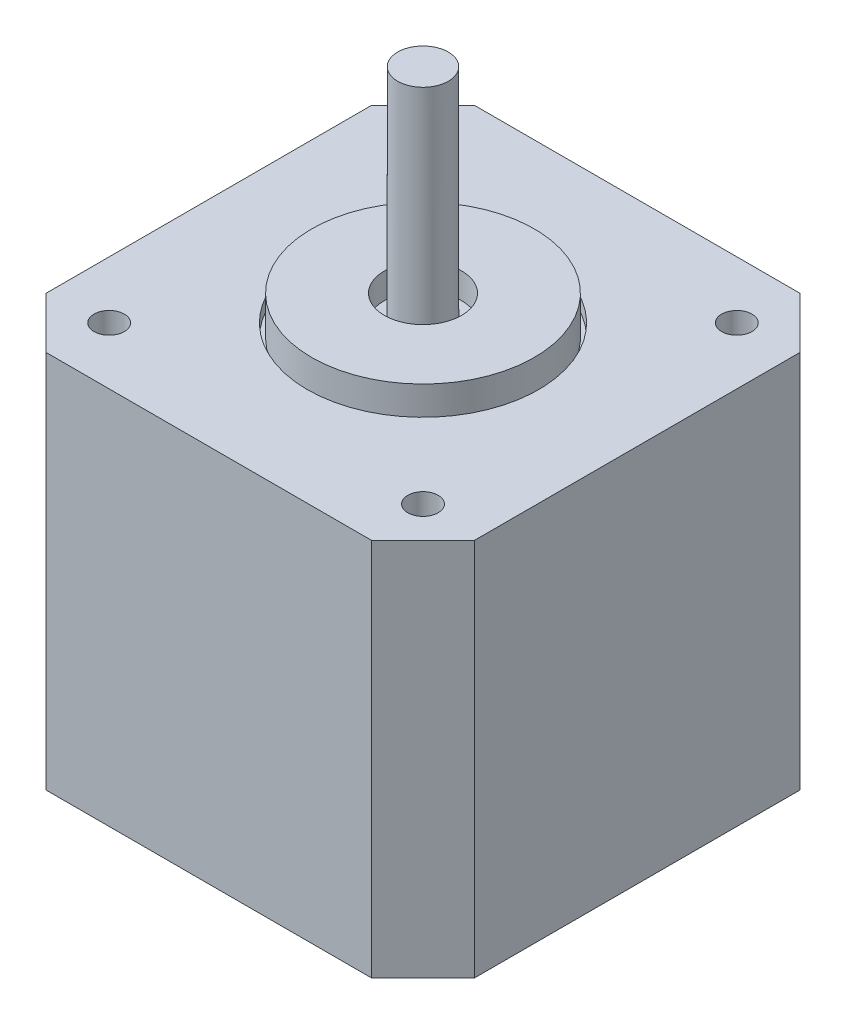
ISO-10303-21;
HEADER;
FILE_DESCRIPTION(('STEP AP214'),'2;1');
FILE_NAME('part.step','',(''),(''),'','','');
FILE_SCHEMA(('AUTOMOTIVE_DESIGN { 1 0 10303 214 1 1 1 1 }'));
ENDSEC;
DATA;
#1=APPLICATION_CONTEXT('core data for automotive mechanical design processes');
#2=APPLICATION_PROTOCOL_DEFINITION('international standard','automotive_design',2000,#1);
#3=PRODUCT_CONTEXT('',#1,'mechanical');
#4=PRODUCT('Part','Part','',(#3));
#5=PRODUCT_RELATED_PRODUCT_CATEGORY('part','',(#4));
#6=PRODUCT_DEFINITION_FORMATION('','',#4);
#7=PRODUCT_DEFINITION_CONTEXT('part definition',#1,'design');
#8=PRODUCT_DEFINITION('design','',#6,#7);
#9=PRODUCT_DEFINITION_SHAPE('','',#8);
#10=(LENGTH_UNIT() NAMED_UNIT(*) SI_UNIT(.MILLI.,.METRE.));
#11=(NAMED_UNIT(*) PLANE_ANGLE_UNIT() SI_UNIT($,.RADIAN.));
#12=(NAMED_UNIT(*) SI_UNIT($,.STERADIAN.) SOLID_ANGLE_UNIT());
#13=UNCERTAINTY_MEASURE_WITH_UNIT(LENGTH_MEASURE(1.E-05),#10,'distance_accuracy_value','');
#14=(GEOMETRIC_REPRESENTATION_CONTEXT(3) GLOBAL_UNCERTAINTY_ASSIGNED_CONTEXT((#13)) GLOBAL_UNIT_ASSIGNED_CONTEXT((#10,
#11,#12)) REPRESENTATION_CONTEXT('',''));
#15=CARTESIAN_POINT('',(0.,0.,0.));
#16=DIRECTION('',(0.,0.,1.));
#17=DIRECTION('',(1.,0.,0.));
#18=AXIS2_PLACEMENT_3D('',#15,#16,#17);
#19=CARTESIAN_POINT('',(0.,37.4396,0.));
#20=DIRECTION('',(0.,-1.,0.));
#21=DIRECTION('',(0.,0.,-1.));
#22=AXIS2_PLACEMENT_3D('',#19,#20,#21);
#23=PLANE('',#22);
#24=CARTESIAN_POINT('',(0.,37.4396,0.));
#25=DIRECTION('',(0.,1.,0.));
#26=DIRECTION('',(0.,0.,1.));
#27=AXIS2_PLACEMENT_3D('',#24,#25,#26);
#28=CIRCLE('',#27,3.81);
#29=CARTESIAN_POINT('',(0.,37.4396,3.81));
#30=VERTEX_POINT('',#29);
#31=EDGE_CURVE('E191',#30,#30,#28,.T.);
#32=ORIENTED_EDGE('',*,*,#31,.T.);
#33=EDGE_LOOP('',(#32));
#34=FACE_BOUND('',#33,.T.);
#35=CARTESIAN_POINT('',(0.,37.4396,0.));
#36=DIRECTION('',(0.,-1.,0.));
#37=DIRECTION('',(0.,0.,-1.));
#38=AXIS2_PLACEMENT_3D('',#35,#36,#37);
#39=CIRCLE('',#38,2.5);
#40=CARTESIAN_POINT('',(0.,37.4396,-2.5));
#41=VERTEX_POINT('',#40);
#42=EDGE_CURVE('E11',#41,#41,#39,.F.);
#43=ORIENTED_EDGE('',*,*,#42,.F.);
#44=EDGE_LOOP('',(#43));
#45=FACE_BOUND('',#44,.T.);
#46=ADVANCED_FACE('F34',(#34,#45),#23,.F.);
#47=CARTESIAN_POINT('',(21.15,37.4396,21.15));
#48=DIRECTION('',(-1.,0.,0.));
#49=DIRECTION('',(0.,0.,1.));
#50=AXIS2_PLACEMENT_3D('',#47,#48,#49);
#51=PLANE('',#50);
#52=DIRECTION('',(0.,0.,-1.));
#53=VECTOR('',#52,1.);
#54=CARTESIAN_POINT('',(21.15,0.,21.15));
#55=LINE('',#54,#53);
#56=CARTESIAN_POINT('',(21.15,0.,16.07));
#57=VERTEX_POINT('',#56);
#58=CARTESIAN_POINT('',(21.15,0.,-16.07));
#59=VERTEX_POINT('',#58);
#60=EDGE_CURVE('E163',#57,#59,#55,.T.);
#61=ORIENTED_EDGE('',*,*,#60,.T.);
#62=DIRECTION('',(0.,1.,0.));
#63=VECTOR('',#62,1.);
#64=CARTESIAN_POINT('',(21.15,37.4396,-16.07));
#65=LINE('',#64,#63);
#66=CARTESIAN_POINT('',(21.15,37.4396,-16.07));
#67=VERTEX_POINT('',#66);
#68=EDGE_CURVE('E42',#59,#67,#65,.T.);
#69=ORIENTED_EDGE('',*,*,#68,.T.);
#70=DIRECTION('',(0.,0.,-1.));
#71=VECTOR('',#70,1.);
#72=CARTESIAN_POINT('',(21.15,37.4396,21.15));
#73=LINE('',#72,#71);
#74=CARTESIAN_POINT('',(21.15,37.4396,16.07));
#75=VERTEX_POINT('',#74);
#76=EDGE_CURVE('E127',#75,#67,#73,.T.);
#77=ORIENTED_EDGE('',*,*,#76,.F.);
#78=DIRECTION('',(0.,-1.,0.));
#79=VECTOR('',#78,1.);
#80=CARTESIAN_POINT('',(21.15,37.4396,16.07));
#81=LINE('',#80,#79);
#82=EDGE_CURVE('E155',#75,#57,#81,.T.);
#83=ORIENTED_EDGE('',*,*,#82,.T.);
#84=EDGE_LOOP('',(#61,#69,#77,#83));
#85=FACE_BOUND('',#84,.T.);
#86=ADVANCED_FACE('F161',(#85),#51,.F.);
#87=CARTESIAN_POINT('',(-21.15,37.4396,-21.15));
#88=DIRECTION('',(0.,0.,1.));
#89=DIRECTION('',(1.,0.,0.));
#90=AXIS2_PLACEMENT_3D('',#87,#88,#89);
#91=PLANE('',#90);
#92=DIRECTION('',(-1.,0.,0.));
#93=VECTOR('',#92,1.);
#94=CARTESIAN_POINT('',(-21.15,0.,-21.15));
#95=LINE('',#94,#93);
#96=CARTESIAN_POINT('',(16.07,0.,-21.15));
#97=VERTEX_POINT('',#96);
#98=CARTESIAN_POINT('',(-16.07,0.,-21.15));
#99=VERTEX_POINT('',#98);
#100=EDGE_CURVE('E132',#97,#99,#95,.T.);
#101=ORIENTED_EDGE('',*,*,#100,.T.);
#102=DIRECTION('',(0.,1.,0.));
#103=VECTOR('',#102,1.);
#104=CARTESIAN_POINT('',(-16.07,37.4396,-21.15));
#105=LINE('',#104,#103);
#106=CARTESIAN_POINT('',(-16.07,37.4396,-21.15));
#107=VERTEX_POINT('',#106);
#108=EDGE_CURVE('E49',#99,#107,#105,.T.);
#109=ORIENTED_EDGE('',*,*,#108,.T.);
#110=DIRECTION('',(-1.,0.,0.));
#111=VECTOR('',#110,1.);
#112=CARTESIAN_POINT('',(-21.15,37.4396,-21.15));
#113=LINE('',#112,#111);
#114=CARTESIAN_POINT('',(16.07,37.4396,-21.15));
#115=VERTEX_POINT('',#114);
#116=EDGE_CURVE('E130',#115,#107,#113,.T.);
#117=ORIENTED_EDGE('',*,*,#116,.F.);
#118=DIRECTION('',(0.,-1.,0.));
#119=VECTOR('',#118,1.);
#120=CARTESIAN_POINT('',(16.07,37.4396,-21.15));
#121=LINE('',#120,#119);
#122=EDGE_CURVE('E151',#115,#97,#121,.T.);
#123=ORIENTED_EDGE('',*,*,#122,.T.);
#124=EDGE_LOOP('',(#101,#109,#117,#123));
#125=FACE_BOUND('',#124,.T.);
#126=ADVANCED_FACE('F171',(#125),#91,.F.);
#127=CARTESIAN_POINT('',(-21.15,37.4396,21.15));
#128=DIRECTION('',(1.,0.,0.));
#129=DIRECTION('',(0.,0.,-1.));
#130=AXIS2_PLACEMENT_3D('',#127,#128,#129);
#131=PLANE('',#130);
#132=DIRECTION('',(0.,0.,1.));
#133=VECTOR('',#132,1.);
#134=CARTESIAN_POINT('',(-21.15,0.,21.15));
#135=LINE('',#134,#133);
#136=CARTESIAN_POINT('',(-21.15,0.,-16.07));
#137=VERTEX_POINT('',#136);
#138=CARTESIAN_POINT('',(-21.15,0.,16.07));
#139=VERTEX_POINT('',#138);
#140=EDGE_CURVE('E128',#137,#139,#135,.T.);
#141=ORIENTED_EDGE('',*,*,#140,.T.);
#142=DIRECTION('',(0.,1.,0.));
#143=VECTOR('',#142,1.);
#144=CARTESIAN_POINT('',(-21.15,37.4396,16.07));
#145=LINE('',#144,#143);
#146=CARTESIAN_POINT('',(-21.15,37.4396,16.07));
#147=VERTEX_POINT('',#146);
#148=EDGE_CURVE('E106',#139,#147,#145,.T.);
#149=ORIENTED_EDGE('',*,*,#148,.T.);
#150=DIRECTION('',(0.,0.,1.));
#151=VECTOR('',#150,1.);
#152=CARTESIAN_POINT('',(-21.15,37.4396,21.15));
#153=LINE('',#152,#151);
#154=CARTESIAN_POINT('',(-21.15,37.4396,-16.07));
#155=VERTEX_POINT('',#154);
#156=EDGE_CURVE('E176',#155,#147,#153,.T.);
#157=ORIENTED_EDGE('',*,*,#156,.F.);
#158=DIRECTION('',(0.,-1.,0.));
#159=VECTOR('',#158,1.);
#160=CARTESIAN_POINT('',(-21.15,37.4396,-16.07));
#161=LINE('',#160,#159);
#162=EDGE_CURVE('E111',#155,#137,#161,.T.);
#163=ORIENTED_EDGE('',*,*,#162,.T.);
#164=EDGE_LOOP('',(#141,#149,#157,#163));
#165=FACE_BOUND('',#164,.T.);
#166=ADVANCED_FACE('F264',(#165),#131,.F.);
#167=CARTESIAN_POINT('',(-21.15,37.4396,21.15));
#168=DIRECTION('',(0.,0.,-1.));
#169=DIRECTION('',(-1.,0.,0.));
#170=AXIS2_PLACEMENT_3D('',#167,#168,#169);
#171=PLANE('',#170);
#172=DIRECTION('',(1.,0.,0.));
#173=VECTOR('',#172,1.);
#174=CARTESIAN_POINT('',(-21.15,37.4396,21.15));
#175=LINE('',#174,#173);
#176=CARTESIAN_POINT('',(-16.07,37.4396,21.15));
#177=VERTEX_POINT('',#176);
#178=CARTESIAN_POINT('',(16.07,37.4396,21.15));
#179=VERTEX_POINT('',#178);
#180=EDGE_CURVE('E121',#177,#179,#175,.T.);
#181=ORIENTED_EDGE('',*,*,#180,.F.);
#182=DIRECTION('',(0.,-1.,0.));
#183=VECTOR('',#182,1.);
#184=CARTESIAN_POINT('',(-16.07,37.4396,21.15));
#185=LINE('',#184,#183);
#186=CARTESIAN_POINT('',(-16.07,0.,21.15));
#187=VERTEX_POINT('',#186);
#188=EDGE_CURVE('E105',#177,#187,#185,.T.);
#189=ORIENTED_EDGE('',*,*,#188,.T.);
#190=DIRECTION('',(1.,0.,0.));
#191=VECTOR('',#190,1.);
#192=CARTESIAN_POINT('',(-21.15,0.,21.15));
#193=LINE('',#192,#191);
#194=CARTESIAN_POINT('',(16.07,0.,21.15));
#195=VERTEX_POINT('',#194);
#196=EDGE_CURVE('E118',#187,#195,#193,.T.);
#197=ORIENTED_EDGE('',*,*,#196,.T.);
#198=DIRECTION('',(0.,1.,0.));
#199=VECTOR('',#198,1.);
#200=CARTESIAN_POINT('',(16.07,37.4396,21.15));
#201=LINE('',#200,#199);
#202=EDGE_CURVE('E123',#195,#179,#201,.T.);
#203=ORIENTED_EDGE('',*,*,#202,.T.);
#204=EDGE_LOOP('',(#181,#189,#197,#203));
#205=FACE_BOUND('',#204,.T.);
#206=ADVANCED_FACE('F117',(#205),#171,.F.);
#207=CARTESIAN_POINT('',(-15.5,37.4396,-15.5));
#208=DIRECTION('',(0.,1.,0.));
#209=DIRECTION('',(0.,0.,1.));
#210=AXIS2_PLACEMENT_3D('',#207,#208,#209);
#211=CIRCLE('',#210,1.5);
#212=CARTESIAN_POINT('',(-15.5,37.4396,-14.));
#213=VERTEX_POINT('',#212);
#214=EDGE_CURVE('E215',#213,#213,#211,.T.);
#215=ORIENTED_EDGE('',*,*,#214,.F.);
#216=EDGE_LOOP('',(#215));
#217=FACE_BOUND('',#216,.T.);
#218=CARTESIAN_POINT('',(-15.5,37.4396,15.5));
#219=DIRECTION('',(0.,1.,0.));
#220=DIRECTION('',(0.,0.,1.));
#221=AXIS2_PLACEMENT_3D('',#218,#219,#220);
#222=CIRCLE('',#221,1.5);
#223=CARTESIAN_POINT('',(-15.5,37.4396,17.));
#224=VERTEX_POINT('',#223);
#225=EDGE_CURVE('E209',#224,#224,#222,.T.);
#226=ORIENTED_EDGE('',*,*,#225,.F.);
#227=EDGE_LOOP('',(#226));
#228=FACE_BOUND('',#227,.T.);
#229=CARTESIAN_POINT('',(15.5,37.4396,15.5));
#230=DIRECTION('',(0.,1.,0.));
#231=DIRECTION('',(0.,0.,1.));
#232=AXIS2_PLACEMENT_3D('',#229,#230,#231);
#233=CIRCLE('',#232,1.5);
#234=CARTESIAN_POINT('',(15.5,37.4396,17.));
#235=VERTEX_POINT('',#234);
#236=EDGE_CURVE('E203',#235,#235,#233,.T.);
#237=ORIENTED_EDGE('',*,*,#236,.F.);
#238=EDGE_LOOP('',(#237));
#239=FACE_BOUND('',#238,.T.);
#240=CARTESIAN_POINT('',(15.5,37.4396,-15.5));
#241=DIRECTION('',(0.,1.,0.));
#242=DIRECTION('',(0.,0.,1.));
#243=AXIS2_PLACEMENT_3D('',#240,#241,#242);
#244=CIRCLE('',#243,1.5);
#245=CARTESIAN_POINT('',(15.5,37.4396,-14.));
#246=VERTEX_POINT('',#245);
#247=EDGE_CURVE('E199',#246,#246,#244,.T.);
#248=ORIENTED_EDGE('',*,*,#247,.F.);
#249=EDGE_LOOP('',(#248));
#250=FACE_BOUND('',#249,.T.);
#251=CARTESIAN_POINT('',(0.,37.4396,0.));
#252=DIRECTION('',(0.,1.,0.));
#253=DIRECTION('',(0.,0.,1.));
#254=AXIS2_PLACEMENT_3D('',#251,#252,#253);
#255=CIRCLE('',#254,11.43);
#256=CARTESIAN_POINT('',(0.,37.4396,11.43));
#257=VERTEX_POINT('',#256);
#258=EDGE_CURVE('E179',#257,#257,#255,.T.);
#259=ORIENTED_EDGE('',*,*,#258,.F.);
#260=EDGE_LOOP('',(#259));
#261=FACE_BOUND('',#260,.T.);
#262=ORIENTED_EDGE('',*,*,#156,.T.);
#263=DIRECTION('',(-0.707106781186546,0.,-0.707106781186549));
#264=VECTOR('',#263,1.);
#265=CARTESIAN_POINT('',(-16.07,37.4396,21.15));
#266=LINE('',#265,#264);
#267=EDGE_CURVE('E149',#147,#177,#266,.F.);
#268=ORIENTED_EDGE('',*,*,#267,.T.);
#269=ORIENTED_EDGE('',*,*,#180,.T.);
#270=DIRECTION('',(-0.707106781186548,0.,0.707106781186547));
#271=VECTOR('',#270,1.);
#272=CARTESIAN_POINT('',(21.15,37.4396,16.07));
#273=LINE('',#272,#271);
#274=EDGE_CURVE('E144',#179,#75,#273,.F.);
#275=ORIENTED_EDGE('',*,*,#274,.T.);
#276=ORIENTED_EDGE('',*,*,#76,.T.);
#277=DIRECTION('',(0.707106781186546,0.,0.707106781186549));
#278=VECTOR('',#277,1.);
#279=CARTESIAN_POINT('',(16.07,37.4396,-21.15));
#280=LINE('',#279,#278);
#281=EDGE_CURVE('E56',#67,#115,#280,.F.);
#282=ORIENTED_EDGE('',*,*,#281,.T.);
#283=ORIENTED_EDGE('',*,*,#116,.T.);
#284=DIRECTION('',(0.707106781186549,0.,-0.707106781186547));
#285=VECTOR('',#284,1.);
#286=CARTESIAN_POINT('',(-21.15,37.4396,-16.07));
#287=LINE('',#286,#285);
#288=EDGE_CURVE('E147',#107,#155,#287,.F.);
#289=ORIENTED_EDGE('',*,*,#288,.T.);
#290=EDGE_LOOP('',(#262,#268,#269,#275,#276,#282,#283,#289));
#291=FACE_BOUND('',#290,.T.);
#292=ADVANCED_FACE('F166',(#217,#228,#239,#250,#261,#291),#23,.F.);
#293=CARTESIAN_POINT('',(0.,0.,0.));
#294=DIRECTION('',(0.,-1.,0.));
#295=DIRECTION('',(0.,0.,-1.));
#296=AXIS2_PLACEMENT_3D('',#293,#294,#295);
#297=PLANE('',#296);
#298=CARTESIAN_POINT('',(-15.5,0.,-15.5));
#299=DIRECTION('',(0.,-1.,0.));
#300=DIRECTION('',(0.,0.,-1.));
#301=AXIS2_PLACEMENT_3D('',#298,#299,#300);
#302=CIRCLE('',#301,1.5);
#303=CARTESIAN_POINT('',(-15.5,0.,-17.));
#304=VERTEX_POINT('',#303);
#305=EDGE_CURVE('E218',#304,#304,#302,.F.);
#306=ORIENTED_EDGE('',*,*,#305,.T.);
#307=EDGE_LOOP('',(#306));
#308=FACE_BOUND('',#307,.T.);
#309=CARTESIAN_POINT('',(-15.5,0.,15.5));
#310=DIRECTION('',(0.,-1.,0.));
#311=DIRECTION('',(0.,0.,-1.));
#312=AXIS2_PLACEMENT_3D('',#309,#310,#311);
#313=CIRCLE('',#312,1.5);
#314=CARTESIAN_POINT('',(-15.5,0.,14.));
#315=VERTEX_POINT('',#314);
#316=EDGE_CURVE('E212',#315,#315,#313,.F.);
#317=ORIENTED_EDGE('',*,*,#316,.T.);
#318=EDGE_LOOP('',(#317));
#319=FACE_BOUND('',#318,.T.);
#320=CARTESIAN_POINT('',(15.5,0.,15.5));
#321=DIRECTION('',(0.,-1.,0.));
#322=DIRECTION('',(0.,0.,-1.));
#323=AXIS2_PLACEMENT_3D('',#320,#321,#322);
#324=CIRCLE('',#323,1.5);
#325=CARTESIAN_POINT('',(15.5,0.,14.));
#326=VERTEX_POINT('',#325);
#327=EDGE_CURVE('E206',#326,#326,#324,.F.);
#328=ORIENTED_EDGE('',*,*,#327,.T.);
#329=EDGE_LOOP('',(#328));
#330=FACE_BOUND('',#329,.T.);
#331=CARTESIAN_POINT('',(15.5,0.,-15.5));
#332=DIRECTION('',(0.,-1.,0.));
#333=DIRECTION('',(0.,0.,-1.));
#334=AXIS2_PLACEMENT_3D('',#331,#332,#333);
#335=CIRCLE('',#334,1.5);
#336=CARTESIAN_POINT('',(15.5,0.,-17.));
#337=VERTEX_POINT('',#336);
#338=EDGE_CURVE('E200',#337,#337,#335,.F.);
#339=ORIENTED_EDGE('',*,*,#338,.T.);
#340=EDGE_LOOP('',(#339));
#341=FACE_BOUND('',#340,.T.);
#342=ORIENTED_EDGE('',*,*,#196,.F.);
#343=DIRECTION('',(0.707106781186546,0.,0.707106781186549));
#344=VECTOR('',#343,1.);
#345=CARTESIAN_POINT('',(-18.61,0.,18.61));
#346=LINE('',#345,#344);
#347=EDGE_CURVE('E101',#187,#139,#346,.F.);
#348=ORIENTED_EDGE('',*,*,#347,.T.);
#349=ORIENTED_EDGE('',*,*,#140,.F.);
#350=DIRECTION('',(-0.707106781186549,0.,0.707106781186547));
#351=VECTOR('',#350,1.);
#352=CARTESIAN_POINT('',(-18.61,0.,-18.61));
#353=LINE('',#352,#351);
#354=EDGE_CURVE('E112',#137,#99,#353,.F.);
#355=ORIENTED_EDGE('',*,*,#354,.T.);
#356=ORIENTED_EDGE('',*,*,#100,.F.);
#357=DIRECTION('',(-0.707106781186546,0.,-0.707106781186549));
#358=VECTOR('',#357,1.);
#359=CARTESIAN_POINT('',(18.61,0.,-18.61));
#360=LINE('',#359,#358);
#361=EDGE_CURVE('E138',#97,#59,#360,.F.);
#362=ORIENTED_EDGE('',*,*,#361,.T.);
#363=ORIENTED_EDGE('',*,*,#60,.F.);
#364=DIRECTION('',(0.707106781186548,0.,-0.707106781186547));
#365=VECTOR('',#364,1.);
#366=CARTESIAN_POINT('',(18.61,0.,18.61));
#367=LINE('',#366,#365);
#368=EDGE_CURVE('E122',#57,#195,#367,.F.);
#369=ORIENTED_EDGE('',*,*,#368,.T.);
#370=EDGE_LOOP('',(#342,#348,#349,#355,#356,#362,#363,#369));
#371=FACE_BOUND('',#370,.T.);
#372=ADVANCED_FACE('F125',(#308,#319,#330,#341,#371),#297,.T.);
#373=CARTESIAN_POINT('',(-16.07,37.4396,21.15));
#374=DIRECTION('',(0.707106781186549,0.,-0.707106781186546));
#375=DIRECTION('',(0.,-1.,0.));
#376=AXIS2_PLACEMENT_3D('',#373,#374,#375);
#377=PLANE('',#376);
#378=ORIENTED_EDGE('',*,*,#267,.F.);
#379=ORIENTED_EDGE('',*,*,#148,.F.);
#380=ORIENTED_EDGE('',*,*,#347,.F.);
#381=ORIENTED_EDGE('',*,*,#188,.F.);
#382=EDGE_LOOP('',(#378,#379,#380,#381));
#383=FACE_BOUND('',#382,.T.);
#384=ADVANCED_FACE('F104',(#383),#377,.F.);
#385=CARTESIAN_POINT('',(-21.15,37.4396,-16.07));
#386=DIRECTION('',(0.707106781186546,0.,0.707106781186548));
#387=DIRECTION('',(0.,-1.,0.));
#388=AXIS2_PLACEMENT_3D('',#385,#386,#387);
#389=PLANE('',#388);
#390=ORIENTED_EDGE('',*,*,#288,.F.);
#391=ORIENTED_EDGE('',*,*,#108,.F.);
#392=ORIENTED_EDGE('',*,*,#354,.F.);
#393=ORIENTED_EDGE('',*,*,#162,.F.);
#394=EDGE_LOOP('',(#390,#391,#392,#393));
#395=FACE_BOUND('',#394,.T.);
#396=ADVANCED_FACE('F272',(#395),#389,.F.);
#397=CARTESIAN_POINT('',(16.07,37.4396,-21.15));
#398=DIRECTION('',(-0.707106781186549,0.,0.707106781186546));
#399=DIRECTION('',(0.,-1.,0.));
#400=AXIS2_PLACEMENT_3D('',#397,#398,#399);
#401=PLANE('',#400);
#402=ORIENTED_EDGE('',*,*,#281,.F.);
#403=ORIENTED_EDGE('',*,*,#68,.F.);
#404=ORIENTED_EDGE('',*,*,#361,.F.);
#405=ORIENTED_EDGE('',*,*,#122,.F.);
#406=EDGE_LOOP('',(#402,#403,#404,#405));
#407=FACE_BOUND('',#406,.T.);
#408=ADVANCED_FACE('F169',(#407),#401,.F.);
#409=CARTESIAN_POINT('',(21.15,37.4396,16.07));
#410=DIRECTION('',(-0.707106781186547,0.,-0.707106781186548));
#411=DIRECTION('',(0.,-1.,0.));
#412=AXIS2_PLACEMENT_3D('',#409,#410,#411);
#413=PLANE('',#412);
#414=ORIENTED_EDGE('',*,*,#274,.F.);
#415=ORIENTED_EDGE('',*,*,#202,.F.);
#416=ORIENTED_EDGE('',*,*,#368,.F.);
#417=ORIENTED_EDGE('',*,*,#82,.F.);
#418=EDGE_LOOP('',(#414,#415,#416,#417));
#419=FACE_BOUND('',#418,.T.);
#420=ADVANCED_FACE('F36',(#419),#413,.F.);
#421=CARTESIAN_POINT('',(0.,36.1696,0.));
#422=DIRECTION('',(0.,1.,0.));
#423=DIRECTION('',(0.,0.,1.));
#424=AXIS2_PLACEMENT_3D('',#421,#422,#423);
#425=CYLINDRICAL_SURFACE('',#424,11.43);
#426=CARTESIAN_POINT('',(0.,36.1696,0.));
#427=DIRECTION('',(0.,1.,0.));
#428=DIRECTION('',(0.,0.,1.));
#429=AXIS2_PLACEMENT_3D('',#426,#427,#428);
#430=CIRCLE('',#429,11.43);
#431=CARTESIAN_POINT('',(0.,36.1696,11.43));
#432=VERTEX_POINT('',#431);
#433=EDGE_CURVE('E172',#432,#432,#430,.T.);
#434=ORIENTED_EDGE('',*,*,#433,.F.);
#435=EDGE_LOOP('',(#434));
#436=FACE_BOUND('',#435,.T.);
#437=ORIENTED_EDGE('',*,*,#258,.T.);
#438=EDGE_LOOP('',(#437));
#439=FACE_BOUND('',#438,.T.);
#440=ADVANCED_FACE('F237',(#436,#439),#425,.F.);
#441=CARTESIAN_POINT('',(0.,36.1696,0.));
#442=DIRECTION('',(0.,1.,0.));
#443=DIRECTION('',(0.,0.,1.));
#444=AXIS2_PLACEMENT_3D('',#441,#442,#443);
#445=PLANE('',#444);
#446=CARTESIAN_POINT('',(0.,36.1696,0.));
#447=DIRECTION('',(0.,1.,0.));
#448=DIRECTION('',(0.,0.,1.));
#449=AXIS2_PLACEMENT_3D('',#446,#447,#448);
#450=CIRCLE('',#449,11.);
#451=CARTESIAN_POINT('',(0.,36.1696,11.));
#452=VERTEX_POINT('',#451);
#453=EDGE_CURVE('E182',#452,#452,#450,.T.);
#454=ORIENTED_EDGE('',*,*,#453,.F.);
#455=EDGE_LOOP('',(#454));
#456=FACE_BOUND('',#455,.T.);
#457=ORIENTED_EDGE('',*,*,#433,.T.);
#458=EDGE_LOOP('',(#457));
#459=FACE_BOUND('',#458,.T.);
#460=ADVANCED_FACE('F239',(#456,#459),#445,.T.);
#461=CARTESIAN_POINT('',(0.,36.1696,0.));
#462=DIRECTION('',(0.,1.,0.));
#463=DIRECTION('',(0.,0.,1.));
#464=AXIS2_PLACEMENT_3D('',#461,#462,#463);
#465=CYLINDRICAL_SURFACE('',#464,11.);
#466=ORIENTED_EDGE('',*,*,#453,.T.);
#467=EDGE_LOOP('',(#466));
#468=FACE_BOUND('',#467,.T.);
#469=CARTESIAN_POINT('',(0.,39.9796,0.));
#470=DIRECTION('',(0.,1.,0.));
#471=DIRECTION('',(0.,0.,1.));
#472=AXIS2_PLACEMENT_3D('',#469,#470,#471);
#473=CIRCLE('',#472,11.);
#474=CARTESIAN_POINT('',(0.,39.9796,11.));
#475=VERTEX_POINT('',#474);
#476=EDGE_CURVE('E187',#475,#475,#473,.T.);
#477=ORIENTED_EDGE('',*,*,#476,.F.);
#478=EDGE_LOOP('',(#477));
#479=FACE_BOUND('',#478,.T.);
#480=ADVANCED_FACE('F246',(#468,#479),#465,.T.);
#481=CARTESIAN_POINT('',(0.,39.9796,0.));
#482=DIRECTION('',(0.,1.,0.));
#483=DIRECTION('',(0.,0.,1.));
#484=AXIS2_PLACEMENT_3D('',#481,#482,#483);
#485=PLANE('',#484);
#486=ORIENTED_EDGE('',*,*,#476,.T.);
#487=EDGE_LOOP('',(#486));
#488=FACE_BOUND('',#487,.T.);
#489=CARTESIAN_POINT('',(0.,39.9796,0.));
#490=DIRECTION('',(0.,1.,0.));
#491=DIRECTION('',(0.,0.,1.));
#492=AXIS2_PLACEMENT_3D('',#489,#490,#491);
#493=CIRCLE('',#492,3.81);
#494=CARTESIAN_POINT('',(0.,39.9796,3.81));
#495=VERTEX_POINT('',#494);
#496=EDGE_CURVE('E190',#495,#495,#493,.T.);
#497=ORIENTED_EDGE('',*,*,#496,.F.);
#498=EDGE_LOOP('',(#497));
#499=FACE_BOUND('',#498,.T.);
#500=ADVANCED_FACE('F324',(#488,#499),#485,.T.);
#501=CARTESIAN_POINT('',(0.,39.9796,0.));
#502=DIRECTION('',(0.,-1.,0.));
#503=DIRECTION('',(0.,0.,-1.));
#504=AXIS2_PLACEMENT_3D('',#501,#502,#503);
#505=CYLINDRICAL_SURFACE('',#504,3.81);
#506=ORIENTED_EDGE('',*,*,#496,.T.);
#507=EDGE_LOOP('',(#506));
#508=FACE_BOUND('',#507,.T.);
#509=ORIENTED_EDGE('',*,*,#31,.F.);
#510=EDGE_LOOP('',(#509));
#511=FACE_BOUND('',#510,.T.);
#512=ADVANCED_FACE('F329',(#508,#511),#505,.F.);
#513=CARTESIAN_POINT('',(0.,59.3598,0.));
#514=DIRECTION('',(0.,-1.,0.));
#515=DIRECTION('',(0.,0.,-1.));
#516=AXIS2_PLACEMENT_3D('',#513,#514,#515);
#517=CYLINDRICAL_SURFACE('',#516,2.5);
#518=CARTESIAN_POINT('',(0.,59.3598,0.));
#519=DIRECTION('',(0.,1.,0.));
#520=DIRECTION('',(0.,0.,1.));
#521=AXIS2_PLACEMENT_3D('',#518,#519,#520);
#522=CIRCLE('',#521,2.5);
#523=CARTESIAN_POINT('',(0.,59.3598,2.5));
#524=VERTEX_POINT('',#523);
#525=EDGE_CURVE('E194',#524,#524,#522,.T.);
#526=ORIENTED_EDGE('',*,*,#525,.F.);
#527=EDGE_LOOP('',(#526));
#528=FACE_BOUND('',#527,.T.);
#529=ORIENTED_EDGE('',*,*,#42,.T.);
#530=EDGE_LOOP('',(#529));
#531=FACE_BOUND('',#530,.T.);
#532=ADVANCED_FACE('F344',(#528,#531),#517,.T.);
#533=CARTESIAN_POINT('',(0.,59.3598,0.));
#534=DIRECTION('',(0.,1.,0.));
#535=DIRECTION('',(0.,0.,1.));
#536=AXIS2_PLACEMENT_3D('',#533,#534,#535);
#537=PLANE('',#536);
#538=ORIENTED_EDGE('',*,*,#525,.T.);
#539=EDGE_LOOP('',(#538));
#540=FACE_BOUND('',#539,.T.);
#541=ADVANCED_FACE('F339',(#540),#537,.T.);
#542=CARTESIAN_POINT('',(15.5,-0.001000000000001,-15.5));
#543=DIRECTION('',(0.,1.,0.));
#544=DIRECTION('',(0.,0.,1.));
#545=AXIS2_PLACEMENT_3D('',#542,#543,#544);
#546=CYLINDRICAL_SURFACE('',#545,1.5);
#547=ORIENTED_EDGE('',*,*,#338,.F.);
#548=EDGE_LOOP('',(#547));
#549=FACE_BOUND('',#548,.T.);
#550=ORIENTED_EDGE('',*,*,#247,.T.);
#551=EDGE_LOOP('',(#550));
#552=FACE_BOUND('',#551,.T.);
#553=ADVANCED_FACE('F343',(#549,#552),#546,.F.);
#554=CARTESIAN_POINT('',(15.5,-0.001000000000001,15.5));
#555=DIRECTION('',(0.,1.,0.));
#556=DIRECTION('',(0.,0.,1.));
#557=AXIS2_PLACEMENT_3D('',#554,#555,#556);
#558=CYLINDRICAL_SURFACE('',#557,1.5);
#559=ORIENTED_EDGE('',*,*,#327,.F.);
#560=EDGE_LOOP('',(#559));
#561=FACE_BOUND('',#560,.T.);
#562=ORIENTED_EDGE('',*,*,#236,.T.);
#563=EDGE_LOOP('',(#562));
#564=FACE_BOUND('',#563,.T.);
#565=ADVANCED_FACE('F378',(#561,#564),#558,.F.);
#566=CARTESIAN_POINT('',(-15.5,-0.001000000000001,15.5));
#567=DIRECTION('',(0.,1.,0.));
#568=DIRECTION('',(0.,0.,1.));
#569=AXIS2_PLACEMENT_3D('',#566,#567,#568);
#570=CYLINDRICAL_SURFACE('',#569,1.5);
#571=ORIENTED_EDGE('',*,*,#316,.F.);
#572=EDGE_LOOP('',(#571));
#573=FACE_BOUND('',#572,.T.);
#574=ORIENTED_EDGE('',*,*,#225,.T.);
#575=EDGE_LOOP('',(#574));
#576=FACE_BOUND('',#575,.T.);
#577=ADVANCED_FACE('F387',(#573,#576),#570,.F.);
#578=CARTESIAN_POINT('',(-15.5,-0.001000000000001,-15.5));
#579=DIRECTION('',(0.,1.,0.));
#580=DIRECTION('',(0.,0.,1.));
#581=AXIS2_PLACEMENT_3D('',#578,#579,#580);
#582=CYLINDRICAL_SURFACE('',#581,1.5);
#583=ORIENTED_EDGE('',*,*,#305,.F.);
#584=EDGE_LOOP('',(#583));
#585=FACE_BOUND('',#584,.T.);
#586=ORIENTED_EDGE('',*,*,#214,.T.);
#587=EDGE_LOOP('',(#586));
#588=FACE_BOUND('',#587,.T.);
#589=ADVANCED_FACE('F224',(#585,#588),#582,.F.);
#590=CLOSED_SHELL('',(#46,#86,#126,#166,#206,#292,#372,#384,#396,#408,#420,#440,#460,#480,#500,
#512,#532,#541,#553,#565,#577,#589));
#591=MANIFOLD_SOLID_BREP('B2',#590);
#592=ADVANCED_BREP_SHAPE_REPRESENTATION('',(#18,#591),#14);
#593=SHAPE_DEFINITION_REPRESENTATION(#9,#592);
ENDSEC;
END-ISO-10303-21;
